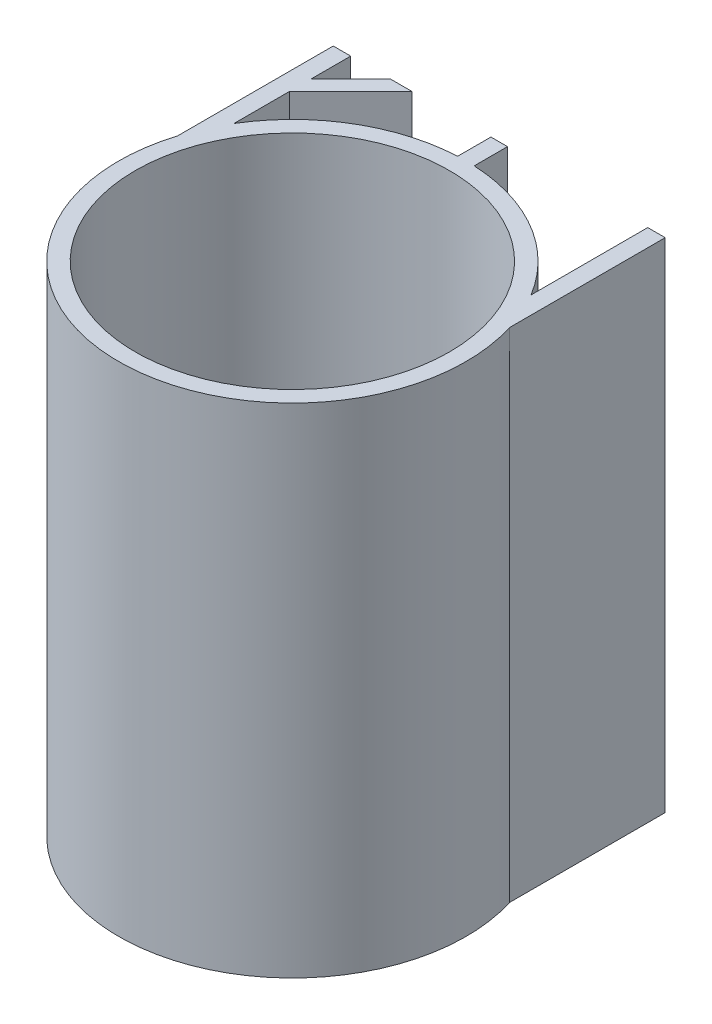
ISO-10303-21;
HEADER;
FILE_DESCRIPTION(('STEP AP214'),'2;1');
FILE_NAME('part.step','',(''),(''),'','','');
FILE_SCHEMA(('AUTOMOTIVE_DESIGN { 1 0 10303 214 1 1 1 1 }'));
ENDSEC;
DATA;
#1=APPLICATION_CONTEXT('core data for automotive mechanical design processes');
#2=APPLICATION_PROTOCOL_DEFINITION('international standard','automotive_design',2000,#1);
#3=PRODUCT_CONTEXT('',#1,'mechanical');
#4=PRODUCT('Part','Part','',(#3));
#5=PRODUCT_RELATED_PRODUCT_CATEGORY('part','',(#4));
#6=PRODUCT_DEFINITION_FORMATION('','',#4);
#7=PRODUCT_DEFINITION_CONTEXT('part definition',#1,'design');
#8=PRODUCT_DEFINITION('design','',#6,#7);
#9=PRODUCT_DEFINITION_SHAPE('','',#8);
#10=(LENGTH_UNIT() NAMED_UNIT(*) SI_UNIT(.MILLI.,.METRE.));
#11=(NAMED_UNIT(*) PLANE_ANGLE_UNIT() SI_UNIT($,.RADIAN.));
#12=(NAMED_UNIT(*) SI_UNIT($,.STERADIAN.) SOLID_ANGLE_UNIT());
#13=UNCERTAINTY_MEASURE_WITH_UNIT(LENGTH_MEASURE(1.E-05),#10,'distance_accuracy_value','');
#14=(GEOMETRIC_REPRESENTATION_CONTEXT(3) GLOBAL_UNCERTAINTY_ASSIGNED_CONTEXT((#13)) GLOBAL_UNIT_ASSIGNED_CONTEXT((#10,
#11,#12)) REPRESENTATION_CONTEXT('',''));
#15=CARTESIAN_POINT('',(0.,0.,0.));
#16=DIRECTION('',(0.,0.,1.));
#17=DIRECTION('',(1.,0.,0.));
#18=AXIS2_PLACEMENT_3D('',#15,#16,#17);
#19=CARTESIAN_POINT('',(-125.00251433104,-18.5470844935013,-360.984533862586));
#20=DIRECTION('',(0.,1.,0.));
#21=DIRECTION('',(1.,0.,0.));
#22=AXIS2_PLACEMENT_3D('',#19,#20,#21);
#23=PLANE('',#22);
#24=CARTESIAN_POINT('',(-125.00251433104,-18.5470844935013,-359.487475190433));
#25=DIRECTION('',(0.,1.,0.));
#26=DIRECTION('',(-1.,0.,0.));
#27=AXIS2_PLACEMENT_3D('',#24,#25,#26);
#28=CIRCLE('',#27,14.2);
#29=CARTESIAN_POINT('',(-110.80251433104,-18.5470844935013,-359.487475190433));
#30=VERTEX_POINT('',#29);
#31=EDGE_CURVE('E361',#30,#30,#28,.T.);
#32=ORIENTED_EDGE('',*,*,#31,.T.);
#33=EDGE_LOOP('',(#32));
#34=FACE_BOUND('',#33,.T.);
#35=DIRECTION('',(0.,0.,-1.));
#36=VECTOR('',#35,1.);
#37=CARTESIAN_POINT('',(-140.00251433104,-18.5470844935013,-378.181592534736));
#38=LINE('',#37,#36);
#39=CARTESIAN_POINT('',(-140.00251433104,-18.5470844935013,-364.123205985034));
#40=VERTEX_POINT('',#39);
#41=CARTESIAN_POINT('',(-140.00251433104,-18.5470844935013,-378.181592534736));
#42=VERTEX_POINT('',#41);
#43=EDGE_CURVE('E11',#40,#42,#38,.T.);
#44=ORIENTED_EDGE('',*,*,#43,.T.);
#45=DIRECTION('',(1.,0.,0.));
#46=VECTOR('',#45,1.);
#47=CARTESIAN_POINT('',(-140.00251433104,-18.5470844935013,-378.181592534736));
#48=LINE('',#47,#46);
#49=CARTESIAN_POINT('',(-138.424511201848,-18.5470844935013,-378.181592534736));
#50=VERTEX_POINT('',#49);
#51=EDGE_CURVE('E175',#42,#50,#48,.T.);
#52=ORIENTED_EDGE('',*,*,#51,.T.);
#53=DIRECTION('',(0.,0.,1.));
#54=VECTOR('',#53,1.);
#55=CARTESIAN_POINT('',(-138.424511201848,-18.5470844935013,-364.123205985034));
#56=LINE('',#55,#54);
#57=CARTESIAN_POINT('',(-138.424511201848,-18.5470844935013,-374.632412268152));
#58=VERTEX_POINT('',#57);
#59=EDGE_CURVE('E178',#50,#58,#56,.T.);
#60=ORIENTED_EDGE('',*,*,#59,.T.);
#61=DIRECTION('',(0.707106781186547,0.,-0.707106781186548));
#62=VECTOR('',#61,1.);
#63=CARTESIAN_POINT('',(-138.424511201848,-18.5470844935013,-374.632412268152));
#64=LINE('',#63,#62);
#65=CARTESIAN_POINT('',(-134.875330935264,-18.5470844935013,-378.181592534736));
#66=VERTEX_POINT('',#65);
#67=EDGE_CURVE('E207',#58,#66,#64,.T.);
#68=ORIENTED_EDGE('',*,*,#67,.T.);
#69=DIRECTION('',(1.,0.,0.));
#70=VECTOR('',#69,1.);
#71=CARTESIAN_POINT('',(-125.00251433104,-18.5470844935013,-378.181592534736));
#72=LINE('',#71,#70);
#73=CARTESIAN_POINT('',(-132.875330935264,-18.5470844935013,-378.181592534736));
#74=VERTEX_POINT('',#73);
#75=EDGE_CURVE('E214',#66,#74,#72,.T.);
#76=ORIENTED_EDGE('',*,*,#75,.T.);
#77=DIRECTION('',(-0.707106781186548,0.,0.707106781186548));
#78=VECTOR('',#77,1.);
#79=CARTESIAN_POINT('',(-138.424511201848,-18.5470844935013,-372.632412268152));
#80=LINE('',#79,#78);
#81=CARTESIAN_POINT('',(-138.424511201848,-18.5470844935013,-372.632412268152));
#82=VERTEX_POINT('',#81);
#83=EDGE_CURVE('E224',#74,#82,#80,.T.);
#84=ORIENTED_EDGE('',*,*,#83,.T.);
#85=DIRECTION('',(0.,0.,1.));
#86=VECTOR('',#85,1.);
#87=CARTESIAN_POINT('',(-138.424511201848,-18.5470844935013,-367.632412268152));
#88=LINE('',#87,#86);
#89=CARTESIAN_POINT('',(-138.424511201848,-18.5470844935013,-367.632412268152));
#90=VERTEX_POINT('',#89);
#91=EDGE_CURVE('E232',#82,#90,#88,.T.);
#92=ORIENTED_EDGE('',*,*,#91,.T.);
#93=CARTESIAN_POINT('',(-125.00251433104,-18.5470844935013,-359.487475190433));
#94=DIRECTION('',(0.,-1.,0.));
#95=DIRECTION('',(-1.,0.,0.));
#96=AXIS2_PLACEMENT_3D('',#93,#94,#95);
#97=CIRCLE('',#96,15.7);
#98=CARTESIAN_POINT('',(-125.75251433104,-18.5470844935013,-375.169550945893));
#99=VERTEX_POINT('',#98);
#100=EDGE_CURVE('E244',#90,#99,#97,.T.);
#101=ORIENTED_EDGE('',*,*,#100,.T.);
#102=DIRECTION('',(0.,0.,-1.));
#103=VECTOR('',#102,1.);
#104=CARTESIAN_POINT('',(-125.75251433104,-18.5470844935013,-378.181592534736));
#105=LINE('',#104,#103);
#106=CARTESIAN_POINT('',(-125.75251433104,-18.5470844935013,-378.181592534736));
#107=VERTEX_POINT('',#106);
#108=EDGE_CURVE('E255',#99,#107,#105,.T.);
#109=ORIENTED_EDGE('',*,*,#108,.T.);
#110=DIRECTION('',(1.,0.,0.));
#111=VECTOR('',#110,1.);
#112=CARTESIAN_POINT('',(-124.25251433104,-18.5470844935013,-378.181592534736));
#113=LINE('',#112,#111);
#114=CARTESIAN_POINT('',(-124.25251433104,-18.5470844935013,-378.181592534736));
#115=VERTEX_POINT('',#114);
#116=EDGE_CURVE('E263',#107,#115,#113,.T.);
#117=ORIENTED_EDGE('',*,*,#116,.T.);
#118=DIRECTION('',(0.,0.,1.));
#119=VECTOR('',#118,1.);
#120=CARTESIAN_POINT('',(-124.25251433104,-18.5470844935013,-374.411152006887));
#121=LINE('',#120,#119);
#122=CARTESIAN_POINT('',(-124.25251433104,-18.5470844935013,-375.169550945893));
#123=VERTEX_POINT('',#122);
#124=EDGE_CURVE('E275',#115,#123,#121,.T.);
#125=ORIENTED_EDGE('',*,*,#124,.T.);
#126=CARTESIAN_POINT('',(-125.00251433104,-18.5470844935013,-359.487475190433));
#127=DIRECTION('',(0.,-1.,0.));
#128=DIRECTION('',(-1.,0.,0.));
#129=AXIS2_PLACEMENT_3D('',#126,#127,#128);
#130=CIRCLE('',#129,15.7);
#131=CARTESIAN_POINT('',(-111.58051433104,-18.5470844935013,-367.632407111574));
#132=VERTEX_POINT('',#131);
#133=EDGE_CURVE('E286',#123,#132,#130,.T.);
#134=ORIENTED_EDGE('',*,*,#133,.T.);
#135=DIRECTION('',(0.,0.,-1.));
#136=VECTOR('',#135,1.);
#137=CARTESIAN_POINT('',(-111.58051433104,-18.5470844935013,-378.181592534736));
#138=LINE('',#137,#136);
#139=CARTESIAN_POINT('',(-111.58051433104,-18.5470844935013,-378.181592534736));
#140=VERTEX_POINT('',#139);
#141=EDGE_CURVE('E298',#132,#140,#138,.T.);
#142=ORIENTED_EDGE('',*,*,#141,.T.);
#143=DIRECTION('',(1.,0.,0.));
#144=VECTOR('',#143,1.);
#145=CARTESIAN_POINT('',(-110.00251433104,-18.5470844935013,-378.181592534736));
#146=LINE('',#145,#144);
#147=CARTESIAN_POINT('',(-110.00251433104,-18.5470844935013,-378.181592534736));
#148=VERTEX_POINT('',#147);
#149=EDGE_CURVE('E305',#140,#148,#146,.T.);
#150=ORIENTED_EDGE('',*,*,#149,.T.);
#151=DIRECTION('',(0.,0.,1.));
#152=VECTOR('',#151,1.);
#153=CARTESIAN_POINT('',(-110.00251433104,-18.5470844935013,-364.123205985034));
#154=LINE('',#153,#152);
#155=CARTESIAN_POINT('',(-110.00251433104,-18.5470844935013,-364.123205985034));
#156=VERTEX_POINT('',#155);
#157=EDGE_CURVE('E325',#148,#156,#154,.T.);
#158=ORIENTED_EDGE('',*,*,#157,.T.);
#159=CARTESIAN_POINT('',(-125.00251433104,-18.5470844935013,-359.487475190433));
#160=DIRECTION('',(0.,-1.,0.));
#161=DIRECTION('',(-1.,0.,0.));
#162=AXIS2_PLACEMENT_3D('',#159,#160,#161);
#163=CIRCLE('',#162,15.7);
#164=EDGE_CURVE('E339',#156,#40,#163,.T.);
#165=ORIENTED_EDGE('',*,*,#164,.T.);
#166=EDGE_LOOP('',(#44,#52,#60,#68,#76,#84,#92,#101,#109,#117,#125,#134,#142,#150,#158,#165));
#167=FACE_BOUND('',#166,.T.);
#168=ADVANCED_FACE('F51',(#34,#167),#23,.F.);
#169=CARTESIAN_POINT('',(-125.00251433104,26.4529155064987,-360.984533862586));
#170=DIRECTION('',(0.,1.,0.));
#171=DIRECTION('',(1.,0.,0.));
#172=AXIS2_PLACEMENT_3D('',#169,#170,#171);
#173=PLANE('',#172);
#174=CARTESIAN_POINT('',(-125.00251433104,26.4529155064987,-359.487475190433));
#175=DIRECTION('',(0.,-1.,0.));
#176=DIRECTION('',(-1.,0.,0.));
#177=AXIS2_PLACEMENT_3D('',#174,#175,#176);
#178=CIRCLE('',#177,14.2);
#179=CARTESIAN_POINT('',(-110.80251433104,26.4529155064987,-359.487475190433));
#180=VERTEX_POINT('',#179);
#181=EDGE_CURVE('E347',#180,#180,#178,.T.);
#182=ORIENTED_EDGE('',*,*,#181,.T.);
#183=EDGE_LOOP('',(#182));
#184=FACE_BOUND('',#183,.T.);
#185=DIRECTION('',(0.,0.,1.));
#186=VECTOR('',#185,1.);
#187=CARTESIAN_POINT('',(-140.00251433104,26.4529155064987,-378.181592534736));
#188=LINE('',#187,#186);
#189=CARTESIAN_POINT('',(-140.00251433104,26.4529155064987,-378.181592534736));
#190=VERTEX_POINT('',#189);
#191=CARTESIAN_POINT('',(-140.00251433104,26.4529155064987,-364.123205985034));
#192=VERTEX_POINT('',#191);
#193=EDGE_CURVE('E54',#190,#192,#188,.T.);
#194=ORIENTED_EDGE('',*,*,#193,.T.);
#195=CARTESIAN_POINT('',(-125.00251433104,26.4529155064987,-359.487475190433));
#196=DIRECTION('',(0.,1.,0.));
#197=DIRECTION('',(-1.,0.,0.));
#198=AXIS2_PLACEMENT_3D('',#195,#196,#197);
#199=CIRCLE('',#198,15.7);
#200=CARTESIAN_POINT('',(-110.00251433104,26.4529155064987,-364.123205985034));
#201=VERTEX_POINT('',#200);
#202=EDGE_CURVE('E343',#192,#201,#199,.T.);
#203=ORIENTED_EDGE('',*,*,#202,.T.);
#204=DIRECTION('',(0.,0.,-1.));
#205=VECTOR('',#204,1.);
#206=CARTESIAN_POINT('',(-110.00251433104,26.4529155064987,-364.123205985034));
#207=LINE('',#206,#205);
#208=CARTESIAN_POINT('',(-110.00251433104,26.4529155064987,-378.181592534736));
#209=VERTEX_POINT('',#208);
#210=EDGE_CURVE('E329',#201,#209,#207,.T.);
#211=ORIENTED_EDGE('',*,*,#210,.T.);
#212=DIRECTION('',(-1.,0.,0.));
#213=VECTOR('',#212,1.);
#214=CARTESIAN_POINT('',(-110.00251433104,26.4529155064987,-378.181592534736));
#215=LINE('',#214,#213);
#216=CARTESIAN_POINT('',(-111.58051433104,26.4529155064987,-378.181592534736));
#217=VERTEX_POINT('',#216);
#218=EDGE_CURVE('E314',#209,#217,#215,.T.);
#219=ORIENTED_EDGE('',*,*,#218,.T.);
#220=DIRECTION('',(0.,0.,1.));
#221=VECTOR('',#220,1.);
#222=CARTESIAN_POINT('',(-111.58051433104,26.4529155064987,-378.181592534736));
#223=LINE('',#222,#221);
#224=CARTESIAN_POINT('',(-111.58051433104,26.4529155064987,-367.632407111574));
#225=VERTEX_POINT('',#224);
#226=EDGE_CURVE('E304',#217,#225,#223,.T.);
#227=ORIENTED_EDGE('',*,*,#226,.T.);
#228=CARTESIAN_POINT('',(-125.00251433104,26.4529155064987,-359.487475190433));
#229=DIRECTION('',(0.,1.,0.));
#230=DIRECTION('',(-1.,0.,0.));
#231=AXIS2_PLACEMENT_3D('',#228,#229,#230);
#232=CIRCLE('',#231,15.7);
#233=CARTESIAN_POINT('',(-124.25251433104,26.4529155064987,-375.169550945893));
#234=VERTEX_POINT('',#233);
#235=EDGE_CURVE('E289',#225,#234,#232,.T.);
#236=ORIENTED_EDGE('',*,*,#235,.T.);
#237=DIRECTION('',(0.,0.,-1.));
#238=VECTOR('',#237,1.);
#239=CARTESIAN_POINT('',(-124.25251433104,26.4529155064987,-374.411152006887));
#240=LINE('',#239,#238);
#241=CARTESIAN_POINT('',(-124.25251433104,26.4529155064987,-378.181592534736));
#242=VERTEX_POINT('',#241);
#243=EDGE_CURVE('E278',#234,#242,#240,.T.);
#244=ORIENTED_EDGE('',*,*,#243,.T.);
#245=DIRECTION('',(-1.,0.,0.));
#246=VECTOR('',#245,1.);
#247=CARTESIAN_POINT('',(-124.25251433104,26.4529155064987,-378.181592534736));
#248=LINE('',#247,#246);
#249=CARTESIAN_POINT('',(-125.75251433104,26.4529155064987,-378.181592534736));
#250=VERTEX_POINT('',#249);
#251=EDGE_CURVE('E267',#242,#250,#248,.T.);
#252=ORIENTED_EDGE('',*,*,#251,.T.);
#253=DIRECTION('',(0.,0.,1.));
#254=VECTOR('',#253,1.);
#255=CARTESIAN_POINT('',(-125.75251433104,26.4529155064987,-378.181592534736));
#256=LINE('',#255,#254);
#257=CARTESIAN_POINT('',(-125.75251433104,26.4529155064987,-375.169550945893));
#258=VERTEX_POINT('',#257);
#259=EDGE_CURVE('E258',#250,#258,#256,.T.);
#260=ORIENTED_EDGE('',*,*,#259,.T.);
#261=CARTESIAN_POINT('',(-125.00251433104,26.4529155064987,-359.487475190433));
#262=DIRECTION('',(0.,1.,0.));
#263=DIRECTION('',(-1.,0.,0.));
#264=AXIS2_PLACEMENT_3D('',#261,#262,#263);
#265=CIRCLE('',#264,15.7);
#266=CARTESIAN_POINT('',(-138.424511201848,26.4529155064987,-367.632412268152));
#267=VERTEX_POINT('',#266);
#268=EDGE_CURVE('E246',#258,#267,#265,.T.);
#269=ORIENTED_EDGE('',*,*,#268,.T.);
#270=DIRECTION('',(0.,0.,-1.));
#271=VECTOR('',#270,1.);
#272=CARTESIAN_POINT('',(-138.424511201848,26.4529155064987,-367.632412268152));
#273=LINE('',#272,#271);
#274=CARTESIAN_POINT('',(-138.424511201848,26.4529155064987,-372.632412268152));
#275=VERTEX_POINT('',#274);
#276=EDGE_CURVE('E236',#267,#275,#273,.T.);
#277=ORIENTED_EDGE('',*,*,#276,.T.);
#278=DIRECTION('',(0.707106781186548,0.,-0.707106781186548));
#279=VECTOR('',#278,1.);
#280=CARTESIAN_POINT('',(-138.424511201848,26.4529155064987,-372.632412268152));
#281=LINE('',#280,#279);
#282=CARTESIAN_POINT('',(-132.875330935264,26.4529155064987,-378.181592534736));
#283=VERTEX_POINT('',#282);
#284=EDGE_CURVE('E227',#275,#283,#281,.T.);
#285=ORIENTED_EDGE('',*,*,#284,.T.);
#286=DIRECTION('',(-1.,0.,0.));
#287=VECTOR('',#286,1.);
#288=CARTESIAN_POINT('',(-125.00251433104,26.4529155064987,-378.181592534736));
#289=LINE('',#288,#287);
#290=CARTESIAN_POINT('',(-134.875330935264,26.4529155064987,-378.181592534736));
#291=VERTEX_POINT('',#290);
#292=EDGE_CURVE('E217',#283,#291,#289,.T.);
#293=ORIENTED_EDGE('',*,*,#292,.T.);
#294=DIRECTION('',(0.707106781186547,0.,-0.707106781186548));
#295=VECTOR('',#294,1.);
#296=CARTESIAN_POINT('',(-138.424511201848,26.4529155064987,-374.632412268152));
#297=LINE('',#296,#295);
#298=CARTESIAN_POINT('',(-138.424511201848,26.4529155064987,-374.632412268152));
#299=VERTEX_POINT('',#298);
#300=EDGE_CURVE('E210',#299,#291,#297,.T.);
#301=ORIENTED_EDGE('',*,*,#300,.F.);
#302=DIRECTION('',(0.,0.,-1.));
#303=VECTOR('',#302,1.);
#304=CARTESIAN_POINT('',(-138.424511201848,26.4529155064987,-364.123205985034));
#305=LINE('',#304,#303);
#306=CARTESIAN_POINT('',(-138.424511201848,26.4529155064987,-378.181592534736));
#307=VERTEX_POINT('',#306);
#308=EDGE_CURVE('E199',#299,#307,#305,.T.);
#309=ORIENTED_EDGE('',*,*,#308,.T.);
#310=DIRECTION('',(1.,0.,0.));
#311=VECTOR('',#310,1.);
#312=CARTESIAN_POINT('',(-140.00251433104,26.4529155064987,-378.181592534736));
#313=LINE('',#312,#311);
#314=EDGE_CURVE('E184',#190,#307,#313,.T.);
#315=ORIENTED_EDGE('',*,*,#314,.F.);
#316=EDGE_LOOP('',(#194,#203,#211,#219,#227,#236,#244,#252,#260,#269,#277,#285,#293,#301,#309,#315));
#317=FACE_BOUND('',#316,.T.);
#318=ADVANCED_FACE('F382',(#184,#317),#173,.T.);
#319=CARTESIAN_POINT('',(-140.00251433104,26.4529155064987,-364.123205985034));
#320=DIRECTION('',(-1.,0.,0.));
#321=DIRECTION('',(0.,0.,1.));
#322=AXIS2_PLACEMENT_3D('',#319,#320,#321);
#323=PLANE('',#322);
#324=ORIENTED_EDGE('',*,*,#193,.F.);
#325=DIRECTION('',(0.,-1.,0.));
#326=VECTOR('',#325,1.);
#327=CARTESIAN_POINT('',(-140.00251433104,26.4529155064987,-378.181592534736));
#328=LINE('',#327,#326);
#329=EDGE_CURVE('E183',#190,#42,#328,.T.);
#330=ORIENTED_EDGE('',*,*,#329,.T.);
#331=ORIENTED_EDGE('',*,*,#43,.F.);
#332=DIRECTION('',(0.,-1.,0.));
#333=VECTOR('',#332,1.);
#334=CARTESIAN_POINT('',(-140.00251433104,26.4529155064987,-364.123205985034));
#335=LINE('',#334,#333);
#336=EDGE_CURVE('E342',#192,#40,#335,.T.);
#337=ORIENTED_EDGE('',*,*,#336,.F.);
#338=EDGE_LOOP('',(#324,#330,#331,#337));
#339=FACE_BOUND('',#338,.T.);
#340=ADVANCED_FACE('F387',(#339),#323,.T.);
#341=CARTESIAN_POINT('',(-140.00251433104,26.4529155064987,-378.181592534736));
#342=DIRECTION('',(0.,0.,-1.));
#343=DIRECTION('',(0.,-1.,0.));
#344=AXIS2_PLACEMENT_3D('',#341,#342,#343);
#345=PLANE('',#344);
#346=ORIENTED_EDGE('',*,*,#314,.T.);
#347=DIRECTION('',(0.,-1.,0.));
#348=VECTOR('',#347,1.);
#349=CARTESIAN_POINT('',(-138.424511201848,26.4529155064987,-378.181592534736));
#350=LINE('',#349,#348);
#351=EDGE_CURVE('E187',#307,#50,#350,.T.);
#352=ORIENTED_EDGE('',*,*,#351,.T.);
#353=ORIENTED_EDGE('',*,*,#51,.F.);
#354=ORIENTED_EDGE('',*,*,#329,.F.);
#355=EDGE_LOOP('',(#346,#352,#353,#354));
#356=FACE_BOUND('',#355,.T.);
#357=ADVANCED_FACE('F188',(#356),#345,.T.);
#358=CARTESIAN_POINT('',(-138.424511201848,26.4529155064987,-378.181592534736));
#359=DIRECTION('',(1.,0.,0.));
#360=DIRECTION('',(0.,1.,0.));
#361=AXIS2_PLACEMENT_3D('',#358,#359,#360);
#362=PLANE('',#361);
#363=ORIENTED_EDGE('',*,*,#308,.F.);
#364=DIRECTION('',(0.,-1.,0.));
#365=VECTOR('',#364,1.);
#366=CARTESIAN_POINT('',(-138.424511201848,26.4529155064987,-374.632412268152));
#367=LINE('',#366,#365);
#368=EDGE_CURVE('E196',#299,#58,#367,.T.);
#369=ORIENTED_EDGE('',*,*,#368,.T.);
#370=ORIENTED_EDGE('',*,*,#59,.F.);
#371=ORIENTED_EDGE('',*,*,#351,.F.);
#372=EDGE_LOOP('',(#363,#369,#370,#371));
#373=FACE_BOUND('',#372,.T.);
#374=ADVANCED_FACE('F194',(#373),#362,.T.);
#375=CARTESIAN_POINT('',(-138.424511201848,26.4529155064987,-374.632412268152));
#376=DIRECTION('',(-0.707106781186548,0.,-0.707106781186547));
#377=DIRECTION('',(-0.707106781186547,0.,0.707106781186548));
#378=AXIS2_PLACEMENT_3D('',#375,#376,#377);
#379=PLANE('',#378);
#380=ORIENTED_EDGE('',*,*,#300,.T.);
#381=DIRECTION('',(0.,-1.,0.));
#382=VECTOR('',#381,1.);
#383=CARTESIAN_POINT('',(-134.875330935264,26.4529155064987,-378.181592534736));
#384=LINE('',#383,#382);
#385=EDGE_CURVE('E213',#291,#66,#384,.T.);
#386=ORIENTED_EDGE('',*,*,#385,.T.);
#387=ORIENTED_EDGE('',*,*,#67,.F.);
#388=ORIENTED_EDGE('',*,*,#368,.F.);
#389=EDGE_LOOP('',(#380,#386,#387,#388));
#390=FACE_BOUND('',#389,.T.);
#391=ADVANCED_FACE('F405',(#390),#379,.T.);
#392=CARTESIAN_POINT('',(-134.875330935264,26.4529155064987,-378.181592534736));
#393=DIRECTION('',(0.,0.,-1.));
#394=DIRECTION('',(0.,-1.,0.));
#395=AXIS2_PLACEMENT_3D('',#392,#393,#394);
#396=PLANE('',#395);
#397=ORIENTED_EDGE('',*,*,#292,.F.);
#398=DIRECTION('',(0.,-1.,0.));
#399=VECTOR('',#398,1.);
#400=CARTESIAN_POINT('',(-132.875330935264,26.4529155064987,-378.181592534736));
#401=LINE('',#400,#399);
#402=EDGE_CURVE('E223',#283,#74,#401,.T.);
#403=ORIENTED_EDGE('',*,*,#402,.T.);
#404=ORIENTED_EDGE('',*,*,#75,.F.);
#405=ORIENTED_EDGE('',*,*,#385,.F.);
#406=EDGE_LOOP('',(#397,#403,#404,#405));
#407=FACE_BOUND('',#406,.T.);
#408=ADVANCED_FACE('F401',(#407),#396,.T.);
#409=CARTESIAN_POINT('',(-132.875330935264,26.4529155064987,-378.181592534736));
#410=DIRECTION('',(0.707106781186548,0.,0.707106781186548));
#411=DIRECTION('',(0.,-1.,0.));
#412=AXIS2_PLACEMENT_3D('',#409,#410,#411);
#413=PLANE('',#412);
#414=ORIENTED_EDGE('',*,*,#284,.F.);
#415=DIRECTION('',(0.,-1.,0.));
#416=VECTOR('',#415,1.);
#417=CARTESIAN_POINT('',(-138.424511201848,26.4529155064987,-372.632412268152));
#418=LINE('',#417,#416);
#419=EDGE_CURVE('E228',#275,#82,#418,.T.);
#420=ORIENTED_EDGE('',*,*,#419,.T.);
#421=ORIENTED_EDGE('',*,*,#83,.F.);
#422=ORIENTED_EDGE('',*,*,#402,.F.);
#423=EDGE_LOOP('',(#414,#420,#421,#422));
#424=FACE_BOUND('',#423,.T.);
#425=ADVANCED_FACE('F397',(#424),#413,.T.);
#426=CARTESIAN_POINT('',(-138.424511201848,26.4529155064987,-372.632412268152));
#427=DIRECTION('',(1.,0.,0.));
#428=DIRECTION('',(0.,1.,0.));
#429=AXIS2_PLACEMENT_3D('',#426,#427,#428);
#430=PLANE('',#429);
#431=ORIENTED_EDGE('',*,*,#276,.F.);
#432=DIRECTION('',(0.,-1.,0.));
#433=VECTOR('',#432,1.);
#434=CARTESIAN_POINT('',(-138.424511201848,26.4529155064987,-367.632412268152));
#435=LINE('',#434,#433);
#436=EDGE_CURVE('E240',#267,#90,#435,.T.);
#437=ORIENTED_EDGE('',*,*,#436,.T.);
#438=ORIENTED_EDGE('',*,*,#91,.F.);
#439=ORIENTED_EDGE('',*,*,#419,.F.);
#440=EDGE_LOOP('',(#431,#437,#438,#439));
#441=FACE_BOUND('',#440,.T.);
#442=ADVANCED_FACE('F400',(#441),#430,.T.);
#443=CARTESIAN_POINT('',(-125.00251433104,26.4529155064987,-359.487475190433));
#444=DIRECTION('',(0.,-1.,0.));
#445=DIRECTION('',(-1.,0.,0.));
#446=AXIS2_PLACEMENT_3D('',#443,#444,#445);
#447=CYLINDRICAL_SURFACE('',#446,15.7);
#448=ORIENTED_EDGE('',*,*,#268,.F.);
#449=DIRECTION('',(0.,-1.,0.));
#450=VECTOR('',#449,1.);
#451=CARTESIAN_POINT('',(-125.75251433104,26.4529155064987,-375.169550945893));
#452=LINE('',#451,#450);
#453=EDGE_CURVE('E251',#258,#99,#452,.T.);
#454=ORIENTED_EDGE('',*,*,#453,.T.);
#455=ORIENTED_EDGE('',*,*,#100,.F.);
#456=ORIENTED_EDGE('',*,*,#436,.F.);
#457=EDGE_LOOP('',(#448,#454,#455,#456));
#458=FACE_BOUND('',#457,.T.);
#459=ADVANCED_FACE('F408',(#458),#447,.T.);
#460=CARTESIAN_POINT('',(-125.75251433104,26.4529155064987,-375.169550945893));
#461=DIRECTION('',(-1.,0.,0.));
#462=DIRECTION('',(0.,0.,1.));
#463=AXIS2_PLACEMENT_3D('',#460,#461,#462);
#464=PLANE('',#463);
#465=ORIENTED_EDGE('',*,*,#259,.F.);
#466=DIRECTION('',(0.,-1.,0.));
#467=VECTOR('',#466,1.);
#468=CARTESIAN_POINT('',(-125.75251433104,26.4529155064987,-378.181592534736));
#469=LINE('',#468,#467);
#470=EDGE_CURVE('E261',#250,#107,#469,.T.);
#471=ORIENTED_EDGE('',*,*,#470,.T.);
#472=ORIENTED_EDGE('',*,*,#108,.F.);
#473=ORIENTED_EDGE('',*,*,#453,.F.);
#474=EDGE_LOOP('',(#465,#471,#472,#473));
#475=FACE_BOUND('',#474,.T.);
#476=ADVANCED_FACE('F412',(#475),#464,.T.);
#477=CARTESIAN_POINT('',(-125.75251433104,26.4529155064987,-378.181592534736));
#478=DIRECTION('',(0.,0.,-1.));
#479=DIRECTION('',(0.,-1.,0.));
#480=AXIS2_PLACEMENT_3D('',#477,#478,#479);
#481=PLANE('',#480);
#482=ORIENTED_EDGE('',*,*,#251,.F.);
#483=DIRECTION('',(0.,-1.,0.));
#484=VECTOR('',#483,1.);
#485=CARTESIAN_POINT('',(-124.25251433104,26.4529155064987,-378.181592534736));
#486=LINE('',#485,#484);
#487=EDGE_CURVE('E271',#242,#115,#486,.T.);
#488=ORIENTED_EDGE('',*,*,#487,.T.);
#489=ORIENTED_EDGE('',*,*,#116,.F.);
#490=ORIENTED_EDGE('',*,*,#470,.F.);
#491=EDGE_LOOP('',(#482,#488,#489,#490));
#492=FACE_BOUND('',#491,.T.);
#493=ADVANCED_FACE('F416',(#492),#481,.T.);
#494=CARTESIAN_POINT('',(-124.25251433104,26.4529155064987,-378.181592534736));
#495=DIRECTION('',(1.,0.,0.));
#496=DIRECTION('',(0.,1.,0.));
#497=AXIS2_PLACEMENT_3D('',#494,#495,#496);
#498=PLANE('',#497);
#499=ORIENTED_EDGE('',*,*,#243,.F.);
#500=DIRECTION('',(0.,-1.,0.));
#501=VECTOR('',#500,1.);
#502=CARTESIAN_POINT('',(-124.25251433104,26.4529155064987,-375.169550945893));
#503=LINE('',#502,#501);
#504=EDGE_CURVE('E282',#234,#123,#503,.T.);
#505=ORIENTED_EDGE('',*,*,#504,.T.);
#506=ORIENTED_EDGE('',*,*,#124,.F.);
#507=ORIENTED_EDGE('',*,*,#487,.F.);
#508=EDGE_LOOP('',(#499,#505,#506,#507));
#509=FACE_BOUND('',#508,.T.);
#510=ADVANCED_FACE('F421',(#509),#498,.T.);
#511=CARTESIAN_POINT('',(-125.00251433104,26.4529155064987,-359.487475190433));
#512=DIRECTION('',(0.,-1.,0.));
#513=DIRECTION('',(-1.,0.,0.));
#514=AXIS2_PLACEMENT_3D('',#511,#512,#513);
#515=CYLINDRICAL_SURFACE('',#514,15.7);
#516=ORIENTED_EDGE('',*,*,#235,.F.);
#517=DIRECTION('',(0.,-1.,0.));
#518=VECTOR('',#517,1.);
#519=CARTESIAN_POINT('',(-111.58051433104,26.4529155064987,-367.632407111574));
#520=LINE('',#519,#518);
#521=EDGE_CURVE('E295',#225,#132,#520,.T.);
#522=ORIENTED_EDGE('',*,*,#521,.T.);
#523=ORIENTED_EDGE('',*,*,#133,.F.);
#524=ORIENTED_EDGE('',*,*,#504,.F.);
#525=EDGE_LOOP('',(#516,#522,#523,#524));
#526=FACE_BOUND('',#525,.T.);
#527=ADVANCED_FACE('F424',(#526),#515,.T.);
#528=CARTESIAN_POINT('',(-111.58051433104,26.4529155064987,-367.632407111574));
#529=DIRECTION('',(-1.,0.,0.));
#530=DIRECTION('',(0.,0.,1.));
#531=AXIS2_PLACEMENT_3D('',#528,#529,#530);
#532=PLANE('',#531);
#533=ORIENTED_EDGE('',*,*,#226,.F.);
#534=DIRECTION('',(0.,-1.,0.));
#535=VECTOR('',#534,1.);
#536=CARTESIAN_POINT('',(-111.58051433104,26.4529155064987,-378.181592534736));
#537=LINE('',#536,#535);
#538=EDGE_CURVE('E300',#217,#140,#537,.T.);
#539=ORIENTED_EDGE('',*,*,#538,.T.);
#540=ORIENTED_EDGE('',*,*,#141,.F.);
#541=ORIENTED_EDGE('',*,*,#521,.F.);
#542=EDGE_LOOP('',(#533,#539,#540,#541));
#543=FACE_BOUND('',#542,.T.);
#544=ADVANCED_FACE('F431',(#543),#532,.T.);
#545=CARTESIAN_POINT('',(-111.58051433104,26.4529155064987,-378.181592534736));
#546=DIRECTION('',(0.,0.,-1.));
#547=DIRECTION('',(0.,-1.,0.));
#548=AXIS2_PLACEMENT_3D('',#545,#546,#547);
#549=PLANE('',#548);
#550=ORIENTED_EDGE('',*,*,#218,.F.);
#551=DIRECTION('',(0.,-1.,0.));
#552=VECTOR('',#551,1.);
#553=CARTESIAN_POINT('',(-110.00251433104,26.4529155064987,-378.181592534736));
#554=LINE('',#553,#552);
#555=EDGE_CURVE('E321',#209,#148,#554,.T.);
#556=ORIENTED_EDGE('',*,*,#555,.T.);
#557=ORIENTED_EDGE('',*,*,#149,.F.);
#558=ORIENTED_EDGE('',*,*,#538,.F.);
#559=EDGE_LOOP('',(#550,#556,#557,#558));
#560=FACE_BOUND('',#559,.T.);
#561=ADVANCED_FACE('F437',(#560),#549,.T.);
#562=CARTESIAN_POINT('',(-110.00251433104,26.4529155064987,-378.181592534736));
#563=DIRECTION('',(1.,0.,0.));
#564=DIRECTION('',(0.,1.,0.));
#565=AXIS2_PLACEMENT_3D('',#562,#563,#564);
#566=PLANE('',#565);
#567=ORIENTED_EDGE('',*,*,#210,.F.);
#568=DIRECTION('',(0.,-1.,0.));
#569=VECTOR('',#568,1.);
#570=CARTESIAN_POINT('',(-110.00251433104,26.4529155064987,-364.123205985034));
#571=LINE('',#570,#569);
#572=EDGE_CURVE('E336',#201,#156,#571,.T.);
#573=ORIENTED_EDGE('',*,*,#572,.T.);
#574=ORIENTED_EDGE('',*,*,#157,.F.);
#575=ORIENTED_EDGE('',*,*,#555,.F.);
#576=EDGE_LOOP('',(#567,#573,#574,#575));
#577=FACE_BOUND('',#576,.T.);
#578=ADVANCED_FACE('F439',(#577),#566,.T.);
#579=CARTESIAN_POINT('',(-125.00251433104,26.4529155064987,-359.487475190433));
#580=DIRECTION('',(0.,-1.,0.));
#581=DIRECTION('',(0.,0.,1.));
#582=AXIS2_PLACEMENT_3D('',#579,#580,#581);
#583=CYLINDRICAL_SURFACE('',#582,15.7);
#584=ORIENTED_EDGE('',*,*,#202,.F.);
#585=ORIENTED_EDGE('',*,*,#336,.T.);
#586=ORIENTED_EDGE('',*,*,#164,.F.);
#587=ORIENTED_EDGE('',*,*,#572,.F.);
#588=EDGE_LOOP('',(#584,#585,#586,#587));
#589=FACE_BOUND('',#588,.T.);
#590=ADVANCED_FACE('F442',(#589),#583,.T.);
#591=CARTESIAN_POINT('',(-125.00251433104,26.4529155064987,-359.487475190433));
#592=DIRECTION('',(0.,-1.,0.));
#593=DIRECTION('',(-1.,0.,0.));
#594=AXIS2_PLACEMENT_3D('',#591,#592,#593);
#595=CYLINDRICAL_SURFACE('',#594,14.2);
#596=ORIENTED_EDGE('',*,*,#31,.F.);
#597=DIRECTION('',(0.,1.,0.));
#598=VECTOR('',#597,1.);
#599=CARTESIAN_POINT('',(-110.80251433104,26.4529155064987,-359.487475190433));
#600=LINE('',#599,#598);
#601=EDGE_CURVE('E360',#30,#180,#600,.T.);
#602=ORIENTED_EDGE('',*,*,#601,.T.);
#603=ORIENTED_EDGE('',*,*,#181,.F.);
#604=ORIENTED_EDGE('',*,*,#601,.F.);
#605=EDGE_LOOP('',(#596,#602,#603,#604));
#606=FACE_BOUND('',#605,.T.);
#607=ADVANCED_FACE('F373',(#606),#595,.F.);
#608=CLOSED_SHELL('',(#168,#318,#340,#357,#374,#391,#408,#425,#442,#459,#476,#493,#510,#527,
#544,#561,#578,#590,#607));
#609=MANIFOLD_SOLID_BREP('B2',#608);
#610=ADVANCED_BREP_SHAPE_REPRESENTATION('',(#18,#609),#14);
#611=SHAPE_DEFINITION_REPRESENTATION(#9,#610);
ENDSEC;
END-ISO-10303-21;
